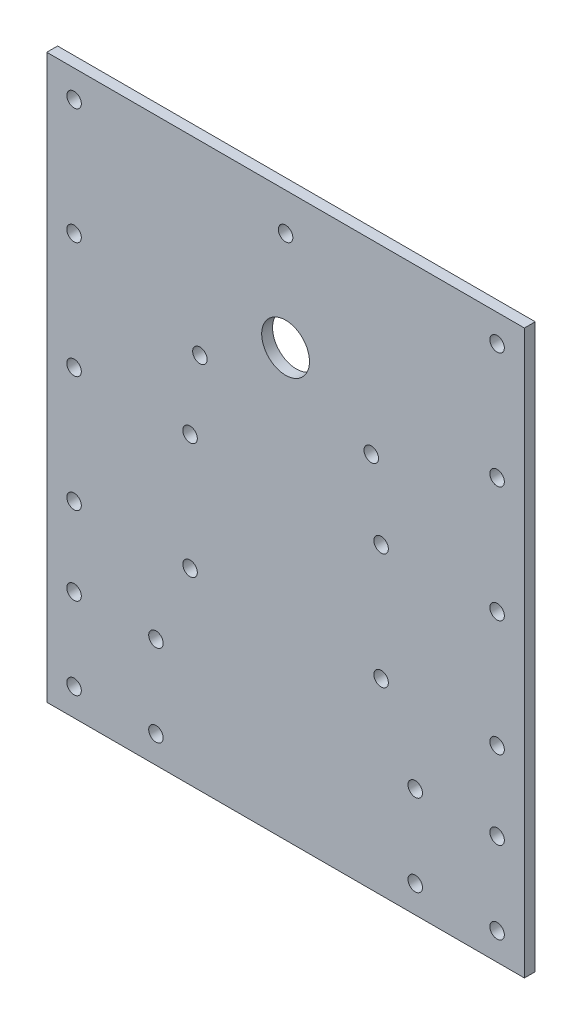
ISO-10303-21;
HEADER;
FILE_DESCRIPTION(('STEP AP214'),'2;1');
FILE_NAME('part.step','',(''),(''),'','','');
FILE_SCHEMA(('AUTOMOTIVE_DESIGN { 1 0 10303 214 1 1 1 1 }'));
ENDSEC;
DATA;
#1=APPLICATION_CONTEXT('core data for automotive mechanical design processes');
#2=APPLICATION_PROTOCOL_DEFINITION('international standard','automotive_design',2000,#1);
#3=PRODUCT_CONTEXT('',#1,'mechanical');
#4=PRODUCT('Part','Part','',(#3));
#5=PRODUCT_RELATED_PRODUCT_CATEGORY('part','',(#4));
#6=PRODUCT_DEFINITION_FORMATION('','',#4);
#7=PRODUCT_DEFINITION_CONTEXT('part definition',#1,'design');
#8=PRODUCT_DEFINITION('design','',#6,#7);
#9=PRODUCT_DEFINITION_SHAPE('','',#8);
#10=(LENGTH_UNIT() NAMED_UNIT(*) SI_UNIT(.MILLI.,.METRE.));
#11=(NAMED_UNIT(*) PLANE_ANGLE_UNIT() SI_UNIT($,.RADIAN.));
#12=(NAMED_UNIT(*) SI_UNIT($,.STERADIAN.) SOLID_ANGLE_UNIT());
#13=UNCERTAINTY_MEASURE_WITH_UNIT(LENGTH_MEASURE(1.E-05),#10,'distance_accuracy_value','');
#14=(GEOMETRIC_REPRESENTATION_CONTEXT(3) GLOBAL_UNCERTAINTY_ASSIGNED_CONTEXT((#13)) GLOBAL_UNIT_ASSIGNED_CONTEXT((#10,
#11,#12)) REPRESENTATION_CONTEXT('',''));
#15=CARTESIAN_POINT('',(0.,0.,0.));
#16=DIRECTION('',(0.,0.,1.));
#17=DIRECTION('',(1.,0.,0.));
#18=AXIS2_PLACEMENT_3D('',#15,#16,#17);
#19=CARTESIAN_POINT('',(0.,0.,3.175));
#20=DIRECTION('',(0.,0.,-1.));
#21=DIRECTION('',(-1.,0.,0.));
#22=AXIS2_PLACEMENT_3D('',#19,#20,#21);
#23=PLANE('',#22);
#24=CARTESIAN_POINT('',(-27.999999999999,-27.5000000000001,3.175));
#25=DIRECTION('',(0.,0.,1.));
#26=DIRECTION('',(1.,0.,0.));
#27=AXIS2_PLACEMENT_3D('',#24,#25,#26);
#28=CIRCLE('',#27,2.125);
#29=CARTESIAN_POINT('',(-25.874999999999,-27.5000000000001,3.175));
#30=VERTEX_POINT('',#29);
#31=EDGE_CURVE('E218',#30,#30,#28,.T.);
#32=ORIENTED_EDGE('',*,*,#31,.F.);
#33=EDGE_LOOP('',(#32));
#34=FACE_BOUND('',#33,.T.);
#35=CARTESIAN_POINT('',(27.9999999999989,-27.5000000000001,3.175));
#36=DIRECTION('',(0.,0.,1.));
#37=DIRECTION('',(-1.,0.,0.));
#38=AXIS2_PLACEMENT_3D('',#35,#36,#37);
#39=CIRCLE('',#38,2.125);
#40=CARTESIAN_POINT('',(25.8749999999989,-27.5000000000001,3.175));
#41=VERTEX_POINT('',#40);
#42=EDGE_CURVE('E229',#41,#41,#39,.T.);
#43=ORIENTED_EDGE('',*,*,#42,.F.);
#44=EDGE_LOOP('',(#43));
#45=FACE_BOUND('',#44,.T.);
#46=CARTESIAN_POINT('',(27.9999999999993,6.49999999999992,3.175));
#47=DIRECTION('',(0.,0.,1.));
#48=DIRECTION('',(-1.,0.,0.));
#49=AXIS2_PLACEMENT_3D('',#46,#47,#48);
#50=CIRCLE('',#49,2.125);
#51=CARTESIAN_POINT('',(25.8749999999993,6.49999999999992,3.175));
#52=VERTEX_POINT('',#51);
#53=EDGE_CURVE('E230',#52,#52,#50,.T.);
#54=ORIENTED_EDGE('',*,*,#53,.F.);
#55=EDGE_LOOP('',(#54));
#56=FACE_BOUND('',#55,.T.);
#57=CARTESIAN_POINT('',(61.9999999999989,-27.5000000000001,3.175));
#58=DIRECTION('',(0.,0.,1.));
#59=DIRECTION('',(-1.,0.,0.));
#60=AXIS2_PLACEMENT_3D('',#57,#58,#59);
#61=CIRCLE('',#60,2.125);
#62=CARTESIAN_POINT('',(59.8749999999989,-27.5000000000001,3.175));
#63=VERTEX_POINT('',#62);
#64=EDGE_CURVE('E241',#63,#63,#61,.T.);
#65=ORIENTED_EDGE('',*,*,#64,.F.);
#66=EDGE_LOOP('',(#65));
#67=FACE_BOUND('',#66,.T.);
#68=CARTESIAN_POINT('',(-61.9999999999997,40.4999999999999,3.175));
#69=DIRECTION('',(0.,0.,1.));
#70=DIRECTION('',(1.,0.,0.));
#71=AXIS2_PLACEMENT_3D('',#68,#69,#70);
#72=CIRCLE('',#71,2.125);
#73=CARTESIAN_POINT('',(-59.8749999999997,40.4999999999999,3.175));
#74=VERTEX_POINT('',#73);
#75=EDGE_CURVE('E199',#74,#74,#72,.T.);
#76=ORIENTED_EDGE('',*,*,#75,.F.);
#77=EDGE_LOOP('',(#76));
#78=FACE_BOUND('',#77,.T.);
#79=CARTESIAN_POINT('',(-61.9999999999993,6.49999999999992,3.175));
#80=DIRECTION('',(0.,0.,1.));
#81=DIRECTION('',(1.,0.,0.));
#82=AXIS2_PLACEMENT_3D('',#79,#80,#81);
#83=CIRCLE('',#82,2.125);
#84=CARTESIAN_POINT('',(-59.8749999999993,6.49999999999992,3.175));
#85=VERTEX_POINT('',#84);
#86=EDGE_CURVE('E205',#85,#85,#83,.T.);
#87=ORIENTED_EDGE('',*,*,#86,.F.);
#88=EDGE_LOOP('',(#87));
#89=FACE_BOUND('',#88,.T.);
#90=CARTESIAN_POINT('',(-61.999999999999,-27.5000000000001,3.175));
#91=DIRECTION('',(0.,0.,1.));
#92=DIRECTION('',(1.,0.,0.));
#93=AXIS2_PLACEMENT_3D('',#90,#91,#92);
#94=CIRCLE('',#93,2.125);
#95=CARTESIAN_POINT('',(-59.874999999999,-27.5000000000001,3.175));
#96=VERTEX_POINT('',#95);
#97=EDGE_CURVE('E206',#96,#96,#94,.T.);
#98=ORIENTED_EDGE('',*,*,#97,.F.);
#99=EDGE_LOOP('',(#98));
#100=FACE_BOUND('',#99,.T.);
#101=CARTESIAN_POINT('',(-27.9999999999993,6.49999999999992,3.175));
#102=DIRECTION('',(0.,0.,1.));
#103=DIRECTION('',(1.,0.,0.));
#104=AXIS2_PLACEMENT_3D('',#101,#102,#103);
#105=CIRCLE('',#104,2.125);
#106=CARTESIAN_POINT('',(-25.8749999999993,6.49999999999992,3.175));
#107=VERTEX_POINT('',#106);
#108=EDGE_CURVE('E217',#107,#107,#105,.T.);
#109=ORIENTED_EDGE('',*,*,#108,.F.);
#110=EDGE_LOOP('',(#109));
#111=FACE_BOUND('',#110,.T.);
#112=CARTESIAN_POINT('',(61.9999999999993,6.49999999999992,3.175));
#113=DIRECTION('',(0.,0.,1.));
#114=DIRECTION('',(-1.,0.,0.));
#115=AXIS2_PLACEMENT_3D('',#112,#113,#114);
#116=CIRCLE('',#115,2.125);
#117=CARTESIAN_POINT('',(59.8749999999993,6.49999999999992,3.175));
#118=VERTEX_POINT('',#117);
#119=EDGE_CURVE('E242',#118,#118,#116,.T.);
#120=ORIENTED_EDGE('',*,*,#119,.F.);
#121=EDGE_LOOP('',(#120));
#122=FACE_BOUND('',#121,.T.);
#123=CARTESIAN_POINT('',(61.9999999999997,40.4999999999999,3.175));
#124=DIRECTION('',(0.,0.,1.));
#125=DIRECTION('',(-1.,0.,0.));
#126=AXIS2_PLACEMENT_3D('',#123,#124,#125);
#127=CIRCLE('',#126,2.125);
#128=CARTESIAN_POINT('',(59.8749999999997,40.4999999999999,3.175));
#129=VERTEX_POINT('',#128);
#130=EDGE_CURVE('E259',#129,#129,#127,.T.);
#131=ORIENTED_EDGE('',*,*,#130,.F.);
#132=EDGE_LOOP('',(#131));
#133=FACE_BOUND('',#132,.T.);
#134=CARTESIAN_POINT('',(62.,74.4999999999999,3.175));
#135=DIRECTION('',(0.,0.,1.));
#136=DIRECTION('',(-1.,0.,0.));
#137=AXIS2_PLACEMENT_3D('',#134,#135,#136);
#138=CIRCLE('',#137,2.125);
#139=CARTESIAN_POINT('',(59.875,74.4999999999999,3.175));
#140=VERTEX_POINT('',#139);
#141=EDGE_CURVE('E253',#140,#140,#138,.T.);
#142=ORIENTED_EDGE('',*,*,#141,.F.);
#143=EDGE_LOOP('',(#142));
#144=FACE_BOUND('',#143,.T.);
#145=CARTESIAN_POINT('',(-62.,74.4999999999999,3.175));
#146=DIRECTION('',(0.,0.,1.));
#147=DIRECTION('',(1.,0.,0.));
#148=AXIS2_PLACEMENT_3D('',#145,#146,#147);
#149=CIRCLE('',#148,2.125);
#150=CARTESIAN_POINT('',(-59.875,74.4999999999999,3.175));
#151=VERTEX_POINT('',#150);
#152=EDGE_CURVE('E196',#151,#151,#149,.T.);
#153=ORIENTED_EDGE('',*,*,#152,.F.);
#154=EDGE_LOOP('',(#153));
#155=FACE_BOUND('',#154,.T.);
#156=DIRECTION('',(0.,1.,0.));
#157=VECTOR('',#156,1.);
#158=CARTESIAN_POINT('',(70.,-82.5000000000001,3.175));
#159=LINE('',#158,#157);
#160=CARTESIAN_POINT('',(70.,-82.5000000000001,3.175));
#161=VERTEX_POINT('',#160);
#162=CARTESIAN_POINT('',(70.,82.4999999999999,3.175));
#163=VERTEX_POINT('',#162);
#164=EDGE_CURVE('E97',#161,#163,#159,.T.);
#165=ORIENTED_EDGE('',*,*,#164,.T.);
#166=DIRECTION('',(-1.,0.,0.));
#167=VECTOR('',#166,1.);
#168=CARTESIAN_POINT('',(-70.,82.4999999999999,3.175));
#169=LINE('',#168,#167);
#170=CARTESIAN_POINT('',(-70.,82.4999999999999,3.175));
#171=VERTEX_POINT('',#170);
#172=EDGE_CURVE('E92',#163,#171,#169,.T.);
#173=ORIENTED_EDGE('',*,*,#172,.T.);
#174=DIRECTION('',(0.,-1.,0.));
#175=VECTOR('',#174,1.);
#176=CARTESIAN_POINT('',(-70.,-82.5000000000001,3.175));
#177=LINE('',#176,#175);
#178=CARTESIAN_POINT('',(-70.,-82.5000000000001,3.175));
#179=VERTEX_POINT('',#178);
#180=EDGE_CURVE('E95',#171,#179,#177,.T.);
#181=ORIENTED_EDGE('',*,*,#180,.T.);
#182=DIRECTION('',(1.,0.,0.));
#183=VECTOR('',#182,1.);
#184=CARTESIAN_POINT('',(-70.,-82.5000000000001,3.175));
#185=LINE('',#184,#183);
#186=EDGE_CURVE('E62',#179,#161,#185,.T.);
#187=ORIENTED_EDGE('',*,*,#186,.T.);
#188=EDGE_LOOP('',(#165,#173,#181,#187));
#189=FACE_BOUND('',#188,.T.);
#190=CARTESIAN_POINT('',(0.,71.4999999999999,3.175));
#191=DIRECTION('',(0.,0.,1.));
#192=DIRECTION('',(1.,0.,0.));
#193=AXIS2_PLACEMENT_3D('',#190,#191,#192);
#194=CIRCLE('',#193,2.125);
#195=CARTESIAN_POINT('',(2.125,71.4999999999999,3.175));
#196=VERTEX_POINT('',#195);
#197=EDGE_CURVE('E112',#196,#196,#194,.T.);
#198=ORIENTED_EDGE('',*,*,#197,.F.);
#199=EDGE_LOOP('',(#198));
#200=FACE_BOUND('',#199,.T.);
#201=CARTESIAN_POINT('',(-62.,-74.5000000000001,3.175));
#202=DIRECTION('',(0.,0.,1.));
#203=DIRECTION('',(1.,0.,0.));
#204=AXIS2_PLACEMENT_3D('',#201,#202,#203);
#205=CIRCLE('',#204,2.125);
#206=CARTESIAN_POINT('',(-59.875,-74.5000000000001,3.175));
#207=VERTEX_POINT('',#206);
#208=EDGE_CURVE('E127',#207,#207,#205,.T.);
#209=ORIENTED_EDGE('',*,*,#208,.F.);
#210=EDGE_LOOP('',(#209));
#211=FACE_BOUND('',#210,.T.);
#212=CARTESIAN_POINT('',(25.1147367097487,27.9999999999999,3.175));
#213=DIRECTION('',(0.,0.,1.));
#214=DIRECTION('',(1.,0.,0.));
#215=AXIS2_PLACEMENT_3D('',#212,#213,#214);
#216=CIRCLE('',#215,2.125);
#217=CARTESIAN_POINT('',(27.2397367097487,27.9999999999999,3.175));
#218=VERTEX_POINT('',#217);
#219=EDGE_CURVE('E133',#218,#218,#216,.T.);
#220=ORIENTED_EDGE('',*,*,#219,.F.);
#221=EDGE_LOOP('',(#220));
#222=FACE_BOUND('',#221,.T.);
#223=CARTESIAN_POINT('',(-25.1147367097487,27.9999999999999,3.175));
#224=DIRECTION('',(0.,0.,1.));
#225=DIRECTION('',(1.,0.,0.));
#226=AXIS2_PLACEMENT_3D('',#223,#224,#225);
#227=CIRCLE('',#226,2.125);
#228=CARTESIAN_POINT('',(-22.9897367097487,27.9999999999999,3.175));
#229=VERTEX_POINT('',#228);
#230=EDGE_CURVE('E139',#229,#229,#227,.T.);
#231=ORIENTED_EDGE('',*,*,#230,.F.);
#232=EDGE_LOOP('',(#231));
#233=FACE_BOUND('',#232,.T.);
#234=CARTESIAN_POINT('',(-38.,-74.5000000000001,3.175));
#235=DIRECTION('',(0.,0.,1.));
#236=DIRECTION('',(-1.,0.,0.));
#237=AXIS2_PLACEMENT_3D('',#234,#235,#236);
#238=CIRCLE('',#237,2.125);
#239=CARTESIAN_POINT('',(-40.125,-74.5000000000001,3.175));
#240=VERTEX_POINT('',#239);
#241=EDGE_CURVE('E145',#240,#240,#238,.T.);
#242=ORIENTED_EDGE('',*,*,#241,.F.);
#243=EDGE_LOOP('',(#242));
#244=FACE_BOUND('',#243,.T.);
#245=CARTESIAN_POINT('',(-38.,-50.5000000000001,3.175));
#246=DIRECTION('',(0.,0.,1.));
#247=DIRECTION('',(1.,0.,0.));
#248=AXIS2_PLACEMENT_3D('',#245,#246,#247);
#249=CIRCLE('',#248,2.125);
#250=CARTESIAN_POINT('',(-35.875,-50.5000000000001,3.175));
#251=VERTEX_POINT('',#250);
#252=EDGE_CURVE('E151',#251,#251,#249,.T.);
#253=ORIENTED_EDGE('',*,*,#252,.F.);
#254=EDGE_LOOP('',(#253));
#255=FACE_BOUND('',#254,.T.);
#256=CARTESIAN_POINT('',(-62.,-50.5000000000001,3.175));
#257=DIRECTION('',(0.,0.,1.));
#258=DIRECTION('',(-1.,0.,0.));
#259=AXIS2_PLACEMENT_3D('',#256,#257,#258);
#260=CIRCLE('',#259,2.125);
#261=CARTESIAN_POINT('',(-64.125,-50.5000000000001,3.175));
#262=VERTEX_POINT('',#261);
#263=EDGE_CURVE('E157',#262,#262,#260,.T.);
#264=ORIENTED_EDGE('',*,*,#263,.F.);
#265=EDGE_LOOP('',(#264));
#266=FACE_BOUND('',#265,.T.);
#267=CARTESIAN_POINT('',(38.0000000000001,-74.5000000000001,3.175));
#268=DIRECTION('',(0.,0.,1.));
#269=DIRECTION('',(1.,0.,0.));
#270=AXIS2_PLACEMENT_3D('',#267,#268,#269);
#271=CIRCLE('',#270,2.125);
#272=CARTESIAN_POINT('',(40.1250000000001,-74.5000000000001,3.175));
#273=VERTEX_POINT('',#272);
#274=EDGE_CURVE('E163',#273,#273,#271,.T.);
#275=ORIENTED_EDGE('',*,*,#274,.F.);
#276=EDGE_LOOP('',(#275));
#277=FACE_BOUND('',#276,.T.);
#278=CARTESIAN_POINT('',(62.0000000000001,-74.5000000000001,3.175));
#279=DIRECTION('',(0.,0.,1.));
#280=DIRECTION('',(-1.,0.,0.));
#281=AXIS2_PLACEMENT_3D('',#278,#279,#280);
#282=CIRCLE('',#281,2.12500000000001);
#283=CARTESIAN_POINT('',(59.875,-74.5000000000001,3.175));
#284=VERTEX_POINT('',#283);
#285=EDGE_CURVE('E169',#284,#284,#282,.T.);
#286=ORIENTED_EDGE('',*,*,#285,.F.);
#287=EDGE_LOOP('',(#286));
#288=FACE_BOUND('',#287,.T.);
#289=CARTESIAN_POINT('',(62.,-50.5000000000001,3.175));
#290=DIRECTION('',(0.,0.,1.));
#291=DIRECTION('',(1.,0.,0.));
#292=AXIS2_PLACEMENT_3D('',#289,#290,#291);
#293=CIRCLE('',#292,2.12500000000001);
#294=CARTESIAN_POINT('',(64.1250000000001,-50.5000000000001,3.175));
#295=VERTEX_POINT('',#294);
#296=EDGE_CURVE('E175',#295,#295,#293,.T.);
#297=ORIENTED_EDGE('',*,*,#296,.F.);
#298=EDGE_LOOP('',(#297));
#299=FACE_BOUND('',#298,.T.);
#300=CARTESIAN_POINT('',(38.0000000000001,-50.5000000000001,3.175));
#301=DIRECTION('',(0.,0.,1.));
#302=DIRECTION('',(-1.,0.,0.));
#303=AXIS2_PLACEMENT_3D('',#300,#301,#302);
#304=CIRCLE('',#303,2.125);
#305=CARTESIAN_POINT('',(35.875,-50.5000000000001,3.175));
#306=VERTEX_POINT('',#305);
#307=EDGE_CURVE('E181',#306,#306,#304,.T.);
#308=ORIENTED_EDGE('',*,*,#307,.F.);
#309=EDGE_LOOP('',(#308));
#310=FACE_BOUND('',#309,.T.);
#311=CARTESIAN_POINT('',(0.,42.4999999999999,3.175));
#312=DIRECTION('',(0.,0.,1.));
#313=DIRECTION('',(1.,0.,0.));
#314=AXIS2_PLACEMENT_3D('',#311,#312,#313);
#315=CIRCLE('',#314,7.);
#316=CARTESIAN_POINT('',(7.,42.4999999999999,3.175));
#317=VERTEX_POINT('',#316);
#318=EDGE_CURVE('E187',#317,#317,#315,.T.);
#319=ORIENTED_EDGE('',*,*,#318,.F.);
#320=EDGE_LOOP('',(#319));
#321=FACE_BOUND('',#320,.T.);
#322=ADVANCED_FACE('F45',(#34,#45,#56,#67,#78,#89,#100,#111,#122,#133,#144,#155,#189,#200,#211,
#222,#233,#244,#255,#266,#277,#288,#299,#310,#321),#23,.F.);
#323=CARTESIAN_POINT('',(0.,0.,0.));
#324=DIRECTION('',(0.,0.,-1.));
#325=DIRECTION('',(-1.,0.,0.));
#326=AXIS2_PLACEMENT_3D('',#323,#324,#325);
#327=PLANE('',#326);
#328=CARTESIAN_POINT('',(-27.999999999999,-27.5000000000001,0.));
#329=DIRECTION('',(0.,0.,1.));
#330=DIRECTION('',(1.,0.,0.));
#331=AXIS2_PLACEMENT_3D('',#328,#329,#330);
#332=CIRCLE('',#331,2.125);
#333=CARTESIAN_POINT('',(-25.874999999999,-27.5000000000001,0.));
#334=VERTEX_POINT('',#333);
#335=EDGE_CURVE('E233',#334,#334,#332,.T.);
#336=ORIENTED_EDGE('',*,*,#335,.T.);
#337=EDGE_LOOP('',(#336));
#338=FACE_BOUND('',#337,.T.);
#339=CARTESIAN_POINT('',(27.9999999999989,-27.5000000000001,0.));
#340=DIRECTION('',(0.,0.,1.));
#341=DIRECTION('',(-1.,0.,0.));
#342=AXIS2_PLACEMENT_3D('',#339,#340,#341);
#343=CIRCLE('',#342,2.125);
#344=CARTESIAN_POINT('',(25.8749999999989,-27.5000000000001,0.));
#345=VERTEX_POINT('',#344);
#346=EDGE_CURVE('E226',#345,#345,#343,.T.);
#347=ORIENTED_EDGE('',*,*,#346,.T.);
#348=EDGE_LOOP('',(#347));
#349=FACE_BOUND('',#348,.T.);
#350=CARTESIAN_POINT('',(27.9999999999993,6.49999999999992,0.));
#351=DIRECTION('',(0.,0.,1.));
#352=DIRECTION('',(-1.,0.,0.));
#353=AXIS2_PLACEMENT_3D('',#350,#351,#352);
#354=CIRCLE('',#353,2.125);
#355=CARTESIAN_POINT('',(25.8749999999993,6.49999999999992,0.));
#356=VERTEX_POINT('',#355);
#357=EDGE_CURVE('E245',#356,#356,#354,.T.);
#358=ORIENTED_EDGE('',*,*,#357,.T.);
#359=EDGE_LOOP('',(#358));
#360=FACE_BOUND('',#359,.T.);
#361=CARTESIAN_POINT('',(61.9999999999989,-27.5000000000001,0.));
#362=DIRECTION('',(0.,0.,1.));
#363=DIRECTION('',(-1.,0.,0.));
#364=AXIS2_PLACEMENT_3D('',#361,#362,#363);
#365=CIRCLE('',#364,2.125);
#366=CARTESIAN_POINT('',(59.8749999999989,-27.5000000000001,0.));
#367=VERTEX_POINT('',#366);
#368=EDGE_CURVE('E238',#367,#367,#365,.T.);
#369=ORIENTED_EDGE('',*,*,#368,.T.);
#370=EDGE_LOOP('',(#369));
#371=FACE_BOUND('',#370,.T.);
#372=CARTESIAN_POINT('',(-61.9999999999997,40.4999999999999,0.));
#373=DIRECTION('',(0.,0.,1.));
#374=DIRECTION('',(1.,0.,0.));
#375=AXIS2_PLACEMENT_3D('',#372,#373,#374);
#376=CIRCLE('',#375,2.125);
#377=CARTESIAN_POINT('',(-59.8749999999997,40.4999999999999,0.));
#378=VERTEX_POINT('',#377);
#379=EDGE_CURVE('E209',#378,#378,#376,.T.);
#380=ORIENTED_EDGE('',*,*,#379,.T.);
#381=EDGE_LOOP('',(#380));
#382=FACE_BOUND('',#381,.T.);
#383=CARTESIAN_POINT('',(-61.9999999999993,6.49999999999992,0.));
#384=DIRECTION('',(0.,0.,1.));
#385=DIRECTION('',(1.,0.,0.));
#386=AXIS2_PLACEMENT_3D('',#383,#384,#385);
#387=CIRCLE('',#386,2.125);
#388=CARTESIAN_POINT('',(-59.8749999999993,6.49999999999992,0.));
#389=VERTEX_POINT('',#388);
#390=EDGE_CURVE('E202',#389,#389,#387,.T.);
#391=ORIENTED_EDGE('',*,*,#390,.T.);
#392=EDGE_LOOP('',(#391));
#393=FACE_BOUND('',#392,.T.);
#394=CARTESIAN_POINT('',(-61.999999999999,-27.5000000000001,0.));
#395=DIRECTION('',(0.,0.,1.));
#396=DIRECTION('',(1.,0.,0.));
#397=AXIS2_PLACEMENT_3D('',#394,#395,#396);
#398=CIRCLE('',#397,2.125);
#399=CARTESIAN_POINT('',(-59.874999999999,-27.5000000000001,0.));
#400=VERTEX_POINT('',#399);
#401=EDGE_CURVE('E221',#400,#400,#398,.T.);
#402=ORIENTED_EDGE('',*,*,#401,.T.);
#403=EDGE_LOOP('',(#402));
#404=FACE_BOUND('',#403,.T.);
#405=CARTESIAN_POINT('',(-27.9999999999993,6.49999999999992,0.));
#406=DIRECTION('',(0.,0.,1.));
#407=DIRECTION('',(1.,0.,0.));
#408=AXIS2_PLACEMENT_3D('',#405,#406,#407);
#409=CIRCLE('',#408,2.125);
#410=CARTESIAN_POINT('',(-25.8749999999993,6.49999999999992,0.));
#411=VERTEX_POINT('',#410);
#412=EDGE_CURVE('E214',#411,#411,#409,.T.);
#413=ORIENTED_EDGE('',*,*,#412,.T.);
#414=EDGE_LOOP('',(#413));
#415=FACE_BOUND('',#414,.T.);
#416=CARTESIAN_POINT('',(61.9999999999993,6.49999999999992,0.));
#417=DIRECTION('',(0.,0.,1.));
#418=DIRECTION('',(-1.,0.,0.));
#419=AXIS2_PLACEMENT_3D('',#416,#417,#418);
#420=CIRCLE('',#419,2.125);
#421=CARTESIAN_POINT('',(59.8749999999993,6.49999999999992,0.));
#422=VERTEX_POINT('',#421);
#423=EDGE_CURVE('E262',#422,#422,#420,.T.);
#424=ORIENTED_EDGE('',*,*,#423,.T.);
#425=EDGE_LOOP('',(#424));
#426=FACE_BOUND('',#425,.T.);
#427=CARTESIAN_POINT('',(61.9999999999997,40.4999999999999,0.));
#428=DIRECTION('',(0.,0.,1.));
#429=DIRECTION('',(-1.,0.,0.));
#430=AXIS2_PLACEMENT_3D('',#427,#428,#429);
#431=CIRCLE('',#430,2.125);
#432=CARTESIAN_POINT('',(59.8749999999997,40.4999999999999,0.));
#433=VERTEX_POINT('',#432);
#434=EDGE_CURVE('E256',#433,#433,#431,.T.);
#435=ORIENTED_EDGE('',*,*,#434,.T.);
#436=EDGE_LOOP('',(#435));
#437=FACE_BOUND('',#436,.T.);
#438=CARTESIAN_POINT('',(62.,74.4999999999999,0.));
#439=DIRECTION('',(0.,0.,1.));
#440=DIRECTION('',(-1.,0.,0.));
#441=AXIS2_PLACEMENT_3D('',#438,#439,#440);
#442=CIRCLE('',#441,2.125);
#443=CARTESIAN_POINT('',(59.875,74.4999999999999,0.));
#444=VERTEX_POINT('',#443);
#445=EDGE_CURVE('E250',#444,#444,#442,.T.);
#446=ORIENTED_EDGE('',*,*,#445,.T.);
#447=EDGE_LOOP('',(#446));
#448=FACE_BOUND('',#447,.T.);
#449=CARTESIAN_POINT('',(-62.,74.4999999999999,0.));
#450=DIRECTION('',(0.,0.,1.));
#451=DIRECTION('',(1.,0.,0.));
#452=AXIS2_PLACEMENT_3D('',#449,#450,#451);
#453=CIRCLE('',#452,2.125);
#454=CARTESIAN_POINT('',(-59.875,74.4999999999999,0.));
#455=VERTEX_POINT('',#454);
#456=EDGE_CURVE('E193',#455,#455,#453,.T.);
#457=ORIENTED_EDGE('',*,*,#456,.T.);
#458=EDGE_LOOP('',(#457));
#459=FACE_BOUND('',#458,.T.);
#460=CARTESIAN_POINT('',(38.0000000000001,-50.5000000000001,0.));
#461=DIRECTION('',(0.,0.,1.));
#462=DIRECTION('',(-1.,0.,0.));
#463=AXIS2_PLACEMENT_3D('',#460,#461,#462);
#464=CIRCLE('',#463,2.125);
#465=CARTESIAN_POINT('',(35.875,-50.5000000000001,0.));
#466=VERTEX_POINT('',#465);
#467=EDGE_CURVE('E184',#466,#466,#464,.T.);
#468=ORIENTED_EDGE('',*,*,#467,.T.);
#469=EDGE_LOOP('',(#468));
#470=FACE_BOUND('',#469,.T.);
#471=CARTESIAN_POINT('',(62.0000000000001,-74.5000000000001,0.));
#472=DIRECTION('',(0.,0.,1.));
#473=DIRECTION('',(-1.,0.,0.));
#474=AXIS2_PLACEMENT_3D('',#471,#472,#473);
#475=CIRCLE('',#474,2.12500000000001);
#476=CARTESIAN_POINT('',(59.875,-74.5000000000001,0.));
#477=VERTEX_POINT('',#476);
#478=EDGE_CURVE('E172',#477,#477,#475,.T.);
#479=ORIENTED_EDGE('',*,*,#478,.T.);
#480=EDGE_LOOP('',(#479));
#481=FACE_BOUND('',#480,.T.);
#482=CARTESIAN_POINT('',(-62.,-50.5000000000001,0.));
#483=DIRECTION('',(0.,0.,1.));
#484=DIRECTION('',(-1.,0.,0.));
#485=AXIS2_PLACEMENT_3D('',#482,#483,#484);
#486=CIRCLE('',#485,2.125);
#487=CARTESIAN_POINT('',(-64.125,-50.5000000000001,0.));
#488=VERTEX_POINT('',#487);
#489=EDGE_CURVE('E160',#488,#488,#486,.T.);
#490=ORIENTED_EDGE('',*,*,#489,.T.);
#491=EDGE_LOOP('',(#490));
#492=FACE_BOUND('',#491,.T.);
#493=CARTESIAN_POINT('',(-38.,-74.5000000000001,0.));
#494=DIRECTION('',(0.,0.,1.));
#495=DIRECTION('',(-1.,0.,0.));
#496=AXIS2_PLACEMENT_3D('',#493,#494,#495);
#497=CIRCLE('',#496,2.125);
#498=CARTESIAN_POINT('',(-40.125,-74.5000000000001,0.));
#499=VERTEX_POINT('',#498);
#500=EDGE_CURVE('E148',#499,#499,#497,.T.);
#501=ORIENTED_EDGE('',*,*,#500,.T.);
#502=EDGE_LOOP('',(#501));
#503=FACE_BOUND('',#502,.T.);
#504=CARTESIAN_POINT('',(25.1147367097487,27.9999999999999,0.));
#505=DIRECTION('',(0.,0.,1.));
#506=DIRECTION('',(1.,0.,0.));
#507=AXIS2_PLACEMENT_3D('',#504,#505,#506);
#508=CIRCLE('',#507,2.125);
#509=CARTESIAN_POINT('',(27.2397367097487,27.9999999999999,0.));
#510=VERTEX_POINT('',#509);
#511=EDGE_CURVE('E136',#510,#510,#508,.T.);
#512=ORIENTED_EDGE('',*,*,#511,.T.);
#513=EDGE_LOOP('',(#512));
#514=FACE_BOUND('',#513,.T.);
#515=CARTESIAN_POINT('',(0.,71.4999999999999,0.));
#516=DIRECTION('',(0.,0.,1.));
#517=DIRECTION('',(1.,0.,0.));
#518=AXIS2_PLACEMENT_3D('',#515,#516,#517);
#519=CIRCLE('',#518,2.125);
#520=CARTESIAN_POINT('',(2.125,71.4999999999999,0.));
#521=VERTEX_POINT('',#520);
#522=EDGE_CURVE('E124',#521,#521,#519,.T.);
#523=ORIENTED_EDGE('',*,*,#522,.T.);
#524=EDGE_LOOP('',(#523));
#525=FACE_BOUND('',#524,.T.);
#526=DIRECTION('',(0.,1.,0.));
#527=VECTOR('',#526,1.);
#528=CARTESIAN_POINT('',(70.,-82.5000000000001,0.));
#529=LINE('',#528,#527);
#530=CARTESIAN_POINT('',(70.,-82.5000000000001,0.));
#531=VERTEX_POINT('',#530);
#532=CARTESIAN_POINT('',(70.,82.4999999999999,0.));
#533=VERTEX_POINT('',#532);
#534=EDGE_CURVE('E109',#531,#533,#529,.T.);
#535=ORIENTED_EDGE('',*,*,#534,.F.);
#536=DIRECTION('',(1.,0.,0.));
#537=VECTOR('',#536,1.);
#538=CARTESIAN_POINT('',(-70.,-82.5000000000001,0.));
#539=LINE('',#538,#537);
#540=CARTESIAN_POINT('',(-70.,-82.5000000000001,0.));
#541=VERTEX_POINT('',#540);
#542=EDGE_CURVE('E85',#541,#531,#539,.T.);
#543=ORIENTED_EDGE('',*,*,#542,.F.);
#544=DIRECTION('',(0.,-1.,0.));
#545=VECTOR('',#544,1.);
#546=CARTESIAN_POINT('',(-70.,-82.5000000000001,0.));
#547=LINE('',#546,#545);
#548=CARTESIAN_POINT('',(-70.,82.4999999999999,0.));
#549=VERTEX_POINT('',#548);
#550=EDGE_CURVE('E79',#549,#541,#547,.T.);
#551=ORIENTED_EDGE('',*,*,#550,.F.);
#552=DIRECTION('',(-1.,0.,0.));
#553=VECTOR('',#552,1.);
#554=CARTESIAN_POINT('',(-70.,82.4999999999999,0.));
#555=LINE('',#554,#553);
#556=EDGE_CURVE('E101',#533,#549,#555,.T.);
#557=ORIENTED_EDGE('',*,*,#556,.F.);
#558=EDGE_LOOP('',(#535,#543,#551,#557));
#559=FACE_BOUND('',#558,.T.);
#560=CARTESIAN_POINT('',(-62.,-74.5000000000001,0.));
#561=DIRECTION('',(0.,0.,1.));
#562=DIRECTION('',(1.,0.,0.));
#563=AXIS2_PLACEMENT_3D('',#560,#561,#562);
#564=CIRCLE('',#563,2.125);
#565=CARTESIAN_POINT('',(-59.875,-74.5000000000001,0.));
#566=VERTEX_POINT('',#565);
#567=EDGE_CURVE('E130',#566,#566,#564,.T.);
#568=ORIENTED_EDGE('',*,*,#567,.T.);
#569=EDGE_LOOP('',(#568));
#570=FACE_BOUND('',#569,.T.);
#571=CARTESIAN_POINT('',(-25.1147367097487,27.9999999999999,0.));
#572=DIRECTION('',(0.,0.,1.));
#573=DIRECTION('',(1.,0.,0.));
#574=AXIS2_PLACEMENT_3D('',#571,#572,#573);
#575=CIRCLE('',#574,2.125);
#576=CARTESIAN_POINT('',(-22.9897367097487,27.9999999999999,0.));
#577=VERTEX_POINT('',#576);
#578=EDGE_CURVE('E142',#577,#577,#575,.T.);
#579=ORIENTED_EDGE('',*,*,#578,.T.);
#580=EDGE_LOOP('',(#579));
#581=FACE_BOUND('',#580,.T.);
#582=CARTESIAN_POINT('',(-38.,-50.5000000000001,0.));
#583=DIRECTION('',(0.,0.,1.));
#584=DIRECTION('',(1.,0.,0.));
#585=AXIS2_PLACEMENT_3D('',#582,#583,#584);
#586=CIRCLE('',#585,2.125);
#587=CARTESIAN_POINT('',(-35.875,-50.5000000000001,0.));
#588=VERTEX_POINT('',#587);
#589=EDGE_CURVE('E154',#588,#588,#586,.T.);
#590=ORIENTED_EDGE('',*,*,#589,.T.);
#591=EDGE_LOOP('',(#590));
#592=FACE_BOUND('',#591,.T.);
#593=CARTESIAN_POINT('',(38.0000000000001,-74.5000000000001,0.));
#594=DIRECTION('',(0.,0.,1.));
#595=DIRECTION('',(1.,0.,0.));
#596=AXIS2_PLACEMENT_3D('',#593,#594,#595);
#597=CIRCLE('',#596,2.125);
#598=CARTESIAN_POINT('',(40.1250000000001,-74.5000000000001,0.));
#599=VERTEX_POINT('',#598);
#600=EDGE_CURVE('E166',#599,#599,#597,.T.);
#601=ORIENTED_EDGE('',*,*,#600,.T.);
#602=EDGE_LOOP('',(#601));
#603=FACE_BOUND('',#602,.T.);
#604=CARTESIAN_POINT('',(62.,-50.5000000000001,0.));
#605=DIRECTION('',(0.,0.,1.));
#606=DIRECTION('',(1.,0.,0.));
#607=AXIS2_PLACEMENT_3D('',#604,#605,#606);
#608=CIRCLE('',#607,2.12500000000001);
#609=CARTESIAN_POINT('',(64.1250000000001,-50.5000000000001,0.));
#610=VERTEX_POINT('',#609);
#611=EDGE_CURVE('E178',#610,#610,#608,.T.);
#612=ORIENTED_EDGE('',*,*,#611,.T.);
#613=EDGE_LOOP('',(#612));
#614=FACE_BOUND('',#613,.T.);
#615=CARTESIAN_POINT('',(0.,42.4999999999999,0.));
#616=DIRECTION('',(0.,0.,1.));
#617=DIRECTION('',(1.,0.,0.));
#618=AXIS2_PLACEMENT_3D('',#615,#616,#617);
#619=CIRCLE('',#618,7.);
#620=CARTESIAN_POINT('',(7.,42.4999999999999,0.));
#621=VERTEX_POINT('',#620);
#622=EDGE_CURVE('E190',#621,#621,#619,.T.);
#623=ORIENTED_EDGE('',*,*,#622,.T.);
#624=EDGE_LOOP('',(#623));
#625=FACE_BOUND('',#624,.T.);
#626=ADVANCED_FACE('F120',(#338,#349,#360,#371,#382,#393,#404,#415,#426,#437,#448,#459,#470,
#481,#492,#503,#514,#525,#559,#570,#581,#592,#603,#614,#625),#327,.T.);
#627=CARTESIAN_POINT('',(70.,-82.5000000000001,3.175));
#628=DIRECTION('',(-1.,0.,0.));
#629=DIRECTION('',(0.,-1.,0.));
#630=AXIS2_PLACEMENT_3D('',#627,#628,#629);
#631=PLANE('',#630);
#632=ORIENTED_EDGE('',*,*,#534,.T.);
#633=DIRECTION('',(0.,0.,-1.));
#634=VECTOR('',#633,1.);
#635=CARTESIAN_POINT('',(70.,82.4999999999999,3.175));
#636=LINE('',#635,#634);
#637=EDGE_CURVE('E11',#163,#533,#636,.T.);
#638=ORIENTED_EDGE('',*,*,#637,.F.);
#639=ORIENTED_EDGE('',*,*,#164,.F.);
#640=DIRECTION('',(0.,0.,-1.));
#641=VECTOR('',#640,1.);
#642=CARTESIAN_POINT('',(70.,-82.5000000000001,3.175));
#643=LINE('',#642,#641);
#644=EDGE_CURVE('E105',#161,#531,#643,.T.);
#645=ORIENTED_EDGE('',*,*,#644,.T.);
#646=EDGE_LOOP('',(#632,#638,#639,#645));
#647=FACE_BOUND('',#646,.T.);
#648=ADVANCED_FACE('F47',(#647),#631,.F.);
#649=CARTESIAN_POINT('',(-70.,82.4999999999999,3.175));
#650=DIRECTION('',(0.,-1.,0.));
#651=DIRECTION('',(1.,0.,0.));
#652=AXIS2_PLACEMENT_3D('',#649,#650,#651);
#653=PLANE('',#652);
#654=ORIENTED_EDGE('',*,*,#556,.T.);
#655=DIRECTION('',(0.,0.,-1.));
#656=VECTOR('',#655,1.);
#657=CARTESIAN_POINT('',(-70.,82.4999999999999,3.175));
#658=LINE('',#657,#656);
#659=EDGE_CURVE('E54',#171,#549,#658,.T.);
#660=ORIENTED_EDGE('',*,*,#659,.F.);
#661=ORIENTED_EDGE('',*,*,#172,.F.);
#662=ORIENTED_EDGE('',*,*,#637,.T.);
#663=EDGE_LOOP('',(#654,#660,#661,#662));
#664=FACE_BOUND('',#663,.T.);
#665=ADVANCED_FACE('F100',(#664),#653,.F.);
#666=CARTESIAN_POINT('',(-70.,-82.5000000000001,3.175));
#667=DIRECTION('',(1.,0.,0.));
#668=DIRECTION('',(0.,0.,-1.));
#669=AXIS2_PLACEMENT_3D('',#666,#667,#668);
#670=PLANE('',#669);
#671=ORIENTED_EDGE('',*,*,#550,.T.);
#672=DIRECTION('',(0.,0.,-1.));
#673=VECTOR('',#672,1.);
#674=CARTESIAN_POINT('',(-70.,-82.5000000000001,3.175));
#675=LINE('',#674,#673);
#676=EDGE_CURVE('E102',#179,#541,#675,.T.);
#677=ORIENTED_EDGE('',*,*,#676,.F.);
#678=ORIENTED_EDGE('',*,*,#180,.F.);
#679=ORIENTED_EDGE('',*,*,#659,.T.);
#680=EDGE_LOOP('',(#671,#677,#678,#679));
#681=FACE_BOUND('',#680,.T.);
#682=ADVANCED_FACE('F103',(#681),#670,.F.);
#683=CARTESIAN_POINT('',(-70.,-82.5000000000001,3.175));
#684=DIRECTION('',(0.,1.,0.));
#685=DIRECTION('',(-1.,0.,0.));
#686=AXIS2_PLACEMENT_3D('',#683,#684,#685);
#687=PLANE('',#686);
#688=ORIENTED_EDGE('',*,*,#542,.T.);
#689=ORIENTED_EDGE('',*,*,#644,.F.);
#690=ORIENTED_EDGE('',*,*,#186,.F.);
#691=ORIENTED_EDGE('',*,*,#676,.T.);
#692=EDGE_LOOP('',(#688,#689,#690,#691));
#693=FACE_BOUND('',#692,.T.);
#694=ADVANCED_FACE('F117',(#693),#687,.F.);
#695=CARTESIAN_POINT('',(0.,71.4999999999999,3.175));
#696=DIRECTION('',(0.,0.,-1.));
#697=DIRECTION('',(-1.,0.,0.));
#698=AXIS2_PLACEMENT_3D('',#695,#696,#697);
#699=CYLINDRICAL_SURFACE('',#698,2.125);
#700=ORIENTED_EDGE('',*,*,#197,.T.);
#701=EDGE_LOOP('',(#700));
#702=FACE_BOUND('',#701,.T.);
#703=ORIENTED_EDGE('',*,*,#522,.F.);
#704=EDGE_LOOP('',(#703));
#705=FACE_BOUND('',#704,.T.);
#706=ADVANCED_FACE('F340',(#702,#705),#699,.F.);
#707=CARTESIAN_POINT('',(-62.,-74.5000000000001,3.175));
#708=DIRECTION('',(0.,0.,-1.));
#709=DIRECTION('',(-1.,0.,0.));
#710=AXIS2_PLACEMENT_3D('',#707,#708,#709);
#711=CYLINDRICAL_SURFACE('',#710,2.125);
#712=ORIENTED_EDGE('',*,*,#208,.T.);
#713=EDGE_LOOP('',(#712));
#714=FACE_BOUND('',#713,.T.);
#715=ORIENTED_EDGE('',*,*,#567,.F.);
#716=EDGE_LOOP('',(#715));
#717=FACE_BOUND('',#716,.T.);
#718=ADVANCED_FACE('F336',(#714,#717),#711,.F.);
#719=CARTESIAN_POINT('',(25.1147367097487,27.9999999999999,3.175));
#720=DIRECTION('',(0.,0.,-1.));
#721=DIRECTION('',(-1.,0.,0.));
#722=AXIS2_PLACEMENT_3D('',#719,#720,#721);
#723=CYLINDRICAL_SURFACE('',#722,2.125);
#724=ORIENTED_EDGE('',*,*,#219,.T.);
#725=EDGE_LOOP('',(#724));
#726=FACE_BOUND('',#725,.T.);
#727=ORIENTED_EDGE('',*,*,#511,.F.);
#728=EDGE_LOOP('',(#727));
#729=FACE_BOUND('',#728,.T.);
#730=ADVANCED_FACE('F332',(#726,#729),#723,.F.);
#731=CARTESIAN_POINT('',(-25.1147367097487,27.9999999999999,3.175));
#732=DIRECTION('',(0.,0.,-1.));
#733=DIRECTION('',(-1.,0.,0.));
#734=AXIS2_PLACEMENT_3D('',#731,#732,#733);
#735=CYLINDRICAL_SURFACE('',#734,2.125);
#736=ORIENTED_EDGE('',*,*,#230,.T.);
#737=EDGE_LOOP('',(#736));
#738=FACE_BOUND('',#737,.T.);
#739=ORIENTED_EDGE('',*,*,#578,.F.);
#740=EDGE_LOOP('',(#739));
#741=FACE_BOUND('',#740,.T.);
#742=ADVANCED_FACE('F328',(#738,#741),#735,.F.);
#743=CARTESIAN_POINT('',(-38.,-74.5000000000001,3.175));
#744=DIRECTION('',(0.,0.,-1.));
#745=DIRECTION('',(-1.,0.,0.));
#746=AXIS2_PLACEMENT_3D('',#743,#744,#745);
#747=CYLINDRICAL_SURFACE('',#746,2.125);
#748=ORIENTED_EDGE('',*,*,#241,.T.);
#749=EDGE_LOOP('',(#748));
#750=FACE_BOUND('',#749,.T.);
#751=ORIENTED_EDGE('',*,*,#500,.F.);
#752=EDGE_LOOP('',(#751));
#753=FACE_BOUND('',#752,.T.);
#754=ADVANCED_FACE('F324',(#750,#753),#747,.F.);
#755=CARTESIAN_POINT('',(-38.,-50.5000000000001,3.175));
#756=DIRECTION('',(0.,0.,-1.));
#757=DIRECTION('',(-1.,0.,0.));
#758=AXIS2_PLACEMENT_3D('',#755,#756,#757);
#759=CYLINDRICAL_SURFACE('',#758,2.125);
#760=ORIENTED_EDGE('',*,*,#252,.T.);
#761=EDGE_LOOP('',(#760));
#762=FACE_BOUND('',#761,.T.);
#763=ORIENTED_EDGE('',*,*,#589,.F.);
#764=EDGE_LOOP('',(#763));
#765=FACE_BOUND('',#764,.T.);
#766=ADVANCED_FACE('F320',(#762,#765),#759,.F.);
#767=CARTESIAN_POINT('',(-62.,-50.5000000000001,3.175));
#768=DIRECTION('',(0.,0.,-1.));
#769=DIRECTION('',(-1.,0.,0.));
#770=AXIS2_PLACEMENT_3D('',#767,#768,#769);
#771=CYLINDRICAL_SURFACE('',#770,2.125);
#772=ORIENTED_EDGE('',*,*,#263,.T.);
#773=EDGE_LOOP('',(#772));
#774=FACE_BOUND('',#773,.T.);
#775=ORIENTED_EDGE('',*,*,#489,.F.);
#776=EDGE_LOOP('',(#775));
#777=FACE_BOUND('',#776,.T.);
#778=ADVANCED_FACE('F316',(#774,#777),#771,.F.);
#779=CARTESIAN_POINT('',(38.0000000000001,-74.5000000000001,3.175));
#780=DIRECTION('',(0.,0.,-1.));
#781=DIRECTION('',(-1.,0.,0.));
#782=AXIS2_PLACEMENT_3D('',#779,#780,#781);
#783=CYLINDRICAL_SURFACE('',#782,2.125);
#784=ORIENTED_EDGE('',*,*,#274,.T.);
#785=EDGE_LOOP('',(#784));
#786=FACE_BOUND('',#785,.T.);
#787=ORIENTED_EDGE('',*,*,#600,.F.);
#788=EDGE_LOOP('',(#787));
#789=FACE_BOUND('',#788,.T.);
#790=ADVANCED_FACE('F312',(#786,#789),#783,.F.);
#791=CARTESIAN_POINT('',(62.0000000000001,-74.5000000000001,3.175));
#792=DIRECTION('',(0.,0.,-1.));
#793=DIRECTION('',(-1.,0.,0.));
#794=AXIS2_PLACEMENT_3D('',#791,#792,#793);
#795=CYLINDRICAL_SURFACE('',#794,2.12500000000001);
#796=ORIENTED_EDGE('',*,*,#285,.T.);
#797=EDGE_LOOP('',(#796));
#798=FACE_BOUND('',#797,.T.);
#799=ORIENTED_EDGE('',*,*,#478,.F.);
#800=EDGE_LOOP('',(#799));
#801=FACE_BOUND('',#800,.T.);
#802=ADVANCED_FACE('F308',(#798,#801),#795,.F.);
#803=CARTESIAN_POINT('',(62.,-50.5000000000001,3.175));
#804=DIRECTION('',(0.,0.,-1.));
#805=DIRECTION('',(-1.,0.,0.));
#806=AXIS2_PLACEMENT_3D('',#803,#804,#805);
#807=CYLINDRICAL_SURFACE('',#806,2.12500000000001);
#808=ORIENTED_EDGE('',*,*,#296,.T.);
#809=EDGE_LOOP('',(#808));
#810=FACE_BOUND('',#809,.T.);
#811=ORIENTED_EDGE('',*,*,#611,.F.);
#812=EDGE_LOOP('',(#811));
#813=FACE_BOUND('',#812,.T.);
#814=ADVANCED_FACE('F304',(#810,#813),#807,.F.);
#815=CARTESIAN_POINT('',(38.0000000000001,-50.5000000000001,3.175));
#816=DIRECTION('',(0.,0.,-1.));
#817=DIRECTION('',(-1.,0.,0.));
#818=AXIS2_PLACEMENT_3D('',#815,#816,#817);
#819=CYLINDRICAL_SURFACE('',#818,2.125);
#820=ORIENTED_EDGE('',*,*,#307,.T.);
#821=EDGE_LOOP('',(#820));
#822=FACE_BOUND('',#821,.T.);
#823=ORIENTED_EDGE('',*,*,#467,.F.);
#824=EDGE_LOOP('',(#823));
#825=FACE_BOUND('',#824,.T.);
#826=ADVANCED_FACE('F294',(#822,#825),#819,.F.);
#827=CARTESIAN_POINT('',(0.,42.4999999999999,3.175));
#828=DIRECTION('',(0.,0.,-1.));
#829=DIRECTION('',(-1.,0.,0.));
#830=AXIS2_PLACEMENT_3D('',#827,#828,#829);
#831=CYLINDRICAL_SURFACE('',#830,7.);
#832=ORIENTED_EDGE('',*,*,#318,.T.);
#833=EDGE_LOOP('',(#832));
#834=FACE_BOUND('',#833,.T.);
#835=ORIENTED_EDGE('',*,*,#622,.F.);
#836=EDGE_LOOP('',(#835));
#837=FACE_BOUND('',#836,.T.);
#838=ADVANCED_FACE('F283',(#834,#837),#831,.F.);
#839=CARTESIAN_POINT('',(-62.,74.4999999999999,0.));
#840=DIRECTION('',(0.,0.,1.));
#841=DIRECTION('',(1.,0.,0.));
#842=AXIS2_PLACEMENT_3D('',#839,#840,#841);
#843=CYLINDRICAL_SURFACE('',#842,2.125);
#844=ORIENTED_EDGE('',*,*,#456,.F.);
#845=EDGE_LOOP('',(#844));
#846=FACE_BOUND('',#845,.T.);
#847=ORIENTED_EDGE('',*,*,#152,.T.);
#848=EDGE_LOOP('',(#847));
#849=FACE_BOUND('',#848,.T.);
#850=ADVANCED_FACE('F280',(#846,#849),#843,.F.);
#851=CARTESIAN_POINT('',(62.,74.4999999999999,0.));
#852=DIRECTION('',(0.,0.,1.));
#853=DIRECTION('',(1.,0.,0.));
#854=AXIS2_PLACEMENT_3D('',#851,#852,#853);
#855=CYLINDRICAL_SURFACE('',#854,2.125);
#856=ORIENTED_EDGE('',*,*,#445,.F.);
#857=EDGE_LOOP('',(#856));
#858=FACE_BOUND('',#857,.T.);
#859=ORIENTED_EDGE('',*,*,#141,.T.);
#860=EDGE_LOOP('',(#859));
#861=FACE_BOUND('',#860,.T.);
#862=ADVANCED_FACE('F282',(#858,#861),#855,.F.);
#863=CARTESIAN_POINT('',(61.9999999999997,40.4999999999999,0.));
#864=DIRECTION('',(0.,0.,1.));
#865=DIRECTION('',(1.,0.,0.));
#866=AXIS2_PLACEMENT_3D('',#863,#864,#865);
#867=CYLINDRICAL_SURFACE('',#866,2.125);
#868=ORIENTED_EDGE('',*,*,#434,.F.);
#869=EDGE_LOOP('',(#868));
#870=FACE_BOUND('',#869,.T.);
#871=ORIENTED_EDGE('',*,*,#130,.T.);
#872=EDGE_LOOP('',(#871));
#873=FACE_BOUND('',#872,.T.);
#874=ADVANCED_FACE('F290',(#870,#873),#867,.F.);
#875=CARTESIAN_POINT('',(61.9999999999993,6.49999999999992,0.));
#876=DIRECTION('',(0.,0.,1.));
#877=DIRECTION('',(1.,0.,0.));
#878=AXIS2_PLACEMENT_3D('',#875,#876,#877);
#879=CYLINDRICAL_SURFACE('',#878,2.125);
#880=ORIENTED_EDGE('',*,*,#423,.F.);
#881=EDGE_LOOP('',(#880));
#882=FACE_BOUND('',#881,.T.);
#883=ORIENTED_EDGE('',*,*,#119,.T.);
#884=EDGE_LOOP('',(#883));
#885=FACE_BOUND('',#884,.T.);
#886=ADVANCED_FACE('F268',(#882,#885),#879,.F.);
#887=CARTESIAN_POINT('',(-27.9999999999993,6.49999999999992,0.));
#888=DIRECTION('',(0.,0.,1.));
#889=DIRECTION('',(1.,0.,0.));
#890=AXIS2_PLACEMENT_3D('',#887,#888,#889);
#891=CYLINDRICAL_SURFACE('',#890,2.125);
#892=ORIENTED_EDGE('',*,*,#412,.F.);
#893=EDGE_LOOP('',(#892));
#894=FACE_BOUND('',#893,.T.);
#895=ORIENTED_EDGE('',*,*,#108,.T.);
#896=EDGE_LOOP('',(#895));
#897=FACE_BOUND('',#896,.T.);
#898=ADVANCED_FACE('F478',(#894,#897),#891,.F.);
#899=CARTESIAN_POINT('',(-61.999999999999,-27.5000000000001,0.));
#900=DIRECTION('',(0.,0.,1.));
#901=DIRECTION('',(1.,0.,0.));
#902=AXIS2_PLACEMENT_3D('',#899,#900,#901);
#903=CYLINDRICAL_SURFACE('',#902,2.125);
#904=ORIENTED_EDGE('',*,*,#401,.F.);
#905=EDGE_LOOP('',(#904));
#906=FACE_BOUND('',#905,.T.);
#907=ORIENTED_EDGE('',*,*,#97,.T.);
#908=EDGE_LOOP('',(#907));
#909=FACE_BOUND('',#908,.T.);
#910=ADVANCED_FACE('F488',(#906,#909),#903,.F.);
#911=CARTESIAN_POINT('',(-61.9999999999993,6.49999999999992,0.));
#912=DIRECTION('',(0.,0.,1.));
#913=DIRECTION('',(1.,0.,0.));
#914=AXIS2_PLACEMENT_3D('',#911,#912,#913);
#915=CYLINDRICAL_SURFACE('',#914,2.125);
#916=ORIENTED_EDGE('',*,*,#390,.F.);
#917=EDGE_LOOP('',(#916));
#918=FACE_BOUND('',#917,.T.);
#919=ORIENTED_EDGE('',*,*,#86,.T.);
#920=EDGE_LOOP('',(#919));
#921=FACE_BOUND('',#920,.T.);
#922=ADVANCED_FACE('F299',(#918,#921),#915,.F.);
#923=CARTESIAN_POINT('',(-61.9999999999997,40.4999999999999,0.));
#924=DIRECTION('',(0.,0.,1.));
#925=DIRECTION('',(1.,0.,0.));
#926=AXIS2_PLACEMENT_3D('',#923,#924,#925);
#927=CYLINDRICAL_SURFACE('',#926,2.125);
#928=ORIENTED_EDGE('',*,*,#379,.F.);
#929=EDGE_LOOP('',(#928));
#930=FACE_BOUND('',#929,.T.);
#931=ORIENTED_EDGE('',*,*,#75,.T.);
#932=EDGE_LOOP('',(#931));
#933=FACE_BOUND('',#932,.T.);
#934=ADVANCED_FACE('F507',(#930,#933),#927,.F.);
#935=CARTESIAN_POINT('',(61.9999999999989,-27.5000000000001,0.));
#936=DIRECTION('',(0.,0.,1.));
#937=DIRECTION('',(1.,0.,0.));
#938=AXIS2_PLACEMENT_3D('',#935,#936,#937);
#939=CYLINDRICAL_SURFACE('',#938,2.125);
#940=ORIENTED_EDGE('',*,*,#368,.F.);
#941=EDGE_LOOP('',(#940));
#942=FACE_BOUND('',#941,.T.);
#943=ORIENTED_EDGE('',*,*,#64,.T.);
#944=EDGE_LOOP('',(#943));
#945=FACE_BOUND('',#944,.T.);
#946=ADVANCED_FACE('F516',(#942,#945),#939,.F.);
#947=CARTESIAN_POINT('',(27.9999999999993,6.49999999999992,0.));
#948=DIRECTION('',(0.,0.,1.));
#949=DIRECTION('',(1.,0.,0.));
#950=AXIS2_PLACEMENT_3D('',#947,#948,#949);
#951=CYLINDRICAL_SURFACE('',#950,2.125);
#952=ORIENTED_EDGE('',*,*,#357,.F.);
#953=EDGE_LOOP('',(#952));
#954=FACE_BOUND('',#953,.T.);
#955=ORIENTED_EDGE('',*,*,#53,.T.);
#956=EDGE_LOOP('',(#955));
#957=FACE_BOUND('',#956,.T.);
#958=ADVANCED_FACE('F525',(#954,#957),#951,.F.);
#959=CARTESIAN_POINT('',(27.9999999999989,-27.5000000000001,0.));
#960=DIRECTION('',(0.,0.,1.));
#961=DIRECTION('',(1.,0.,0.));
#962=AXIS2_PLACEMENT_3D('',#959,#960,#961);
#963=CYLINDRICAL_SURFACE('',#962,2.125);
#964=ORIENTED_EDGE('',*,*,#346,.F.);
#965=EDGE_LOOP('',(#964));
#966=FACE_BOUND('',#965,.T.);
#967=ORIENTED_EDGE('',*,*,#42,.T.);
#968=EDGE_LOOP('',(#967));
#969=FACE_BOUND('',#968,.T.);
#970=ADVANCED_FACE('F535',(#966,#969),#963,.F.);
#971=CARTESIAN_POINT('',(-27.999999999999,-27.5000000000001,0.));
#972=DIRECTION('',(0.,0.,1.));
#973=DIRECTION('',(1.,0.,0.));
#974=AXIS2_PLACEMENT_3D('',#971,#972,#973);
#975=CYLINDRICAL_SURFACE('',#974,2.125);
#976=ORIENTED_EDGE('',*,*,#335,.F.);
#977=EDGE_LOOP('',(#976));
#978=FACE_BOUND('',#977,.T.);
#979=ORIENTED_EDGE('',*,*,#31,.T.);
#980=EDGE_LOOP('',(#979));
#981=FACE_BOUND('',#980,.T.);
#982=ADVANCED_FACE('F545',(#978,#981),#975,.F.);
#983=CLOSED_SHELL('',(#322,#626,#648,#665,#682,#694,#706,#718,#730,#742,#754,#766,#778,#790,
#802,#814,#826,#838,#850,#862,#874,#886,#898,#910,#922,#934,#946,#958,#970,#982));
#984=MANIFOLD_SOLID_BREP('B2',#983);
#985=ADVANCED_BREP_SHAPE_REPRESENTATION('',(#18,#984),#14);
#986=SHAPE_DEFINITION_REPRESENTATION(#9,#985);
ENDSEC;
END-ISO-10303-21;
